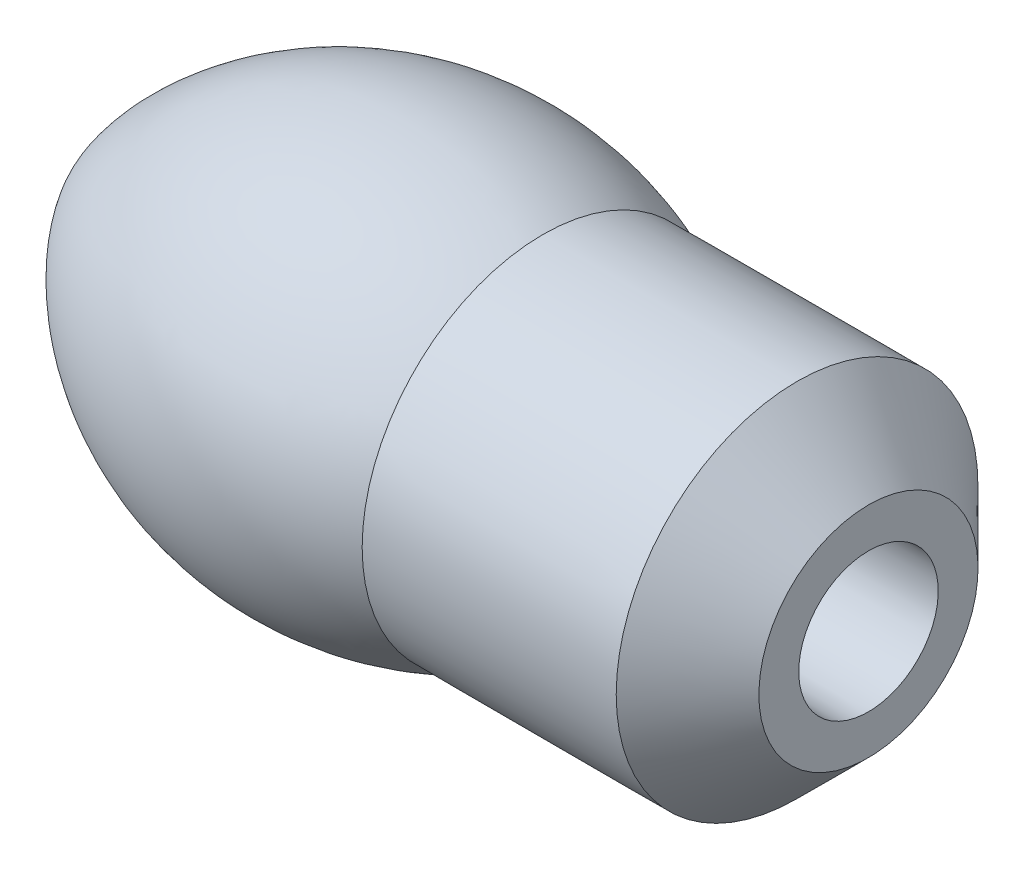
ISO-10303-21;
HEADER;
FILE_DESCRIPTION(('STEP AP214'),'2;1');
FILE_NAME('part.step','',(''),(''),'','','');
FILE_SCHEMA(('AUTOMOTIVE_DESIGN { 1 0 10303 214 1 1 1 1 }'));
ENDSEC;
DATA;
#1=APPLICATION_CONTEXT('core data for automotive mechanical design processes');
#2=APPLICATION_PROTOCOL_DEFINITION('international standard','automotive_design',2000,#1);
#3=PRODUCT_CONTEXT('',#1,'mechanical');
#4=PRODUCT('Part','Part','',(#3));
#5=PRODUCT_RELATED_PRODUCT_CATEGORY('part','',(#4));
#6=PRODUCT_DEFINITION_FORMATION('','',#4);
#7=PRODUCT_DEFINITION_CONTEXT('part definition',#1,'design');
#8=PRODUCT_DEFINITION('design','',#6,#7);
#9=PRODUCT_DEFINITION_SHAPE('','',#8);
#10=(LENGTH_UNIT() NAMED_UNIT(*) SI_UNIT(.MILLI.,.METRE.));
#11=(NAMED_UNIT(*) PLANE_ANGLE_UNIT() SI_UNIT($,.RADIAN.));
#12=(NAMED_UNIT(*) SI_UNIT($,.STERADIAN.) SOLID_ANGLE_UNIT());
#13=UNCERTAINTY_MEASURE_WITH_UNIT(LENGTH_MEASURE(1.E-05),#10,'distance_accuracy_value','');
#14=(GEOMETRIC_REPRESENTATION_CONTEXT(3) GLOBAL_UNCERTAINTY_ASSIGNED_CONTEXT((#13)) GLOBAL_UNIT_ASSIGNED_CONTEXT((#10,
#11,#12)) REPRESENTATION_CONTEXT('',''));
#15=CARTESIAN_POINT('',(0.,0.,0.));
#16=DIRECTION('',(0.,0.,1.));
#17=DIRECTION('',(1.,0.,0.));
#18=AXIS2_PLACEMENT_3D('',#15,#16,#17);
#19=CARTESIAN_POINT('',(0.,0.,0.));
#20=DIRECTION('',(-0.999999567116457,0.00093046595760574,0.));
#21=DIRECTION('',(-0.00093046595760574,-0.999999567116457,0.));
#22=AXIS2_PLACEMENT_3D('',#19,#20,#21);
#23=CONICAL_SURFACE('',#22,0.,1.56986586070303);
#24=CARTESIAN_POINT('',(-0.0243973146141929,2.27008805323411E-05,0.));
#25=DIRECTION('',(0.999999567116457,-0.00093046595760574,0.));
#26=DIRECTION('',(0.00093046595760574,0.999999567116457,0.));
#27=AXIS2_PLACEMENT_3D('',#24,#25,#26);
#28=CIRCLE('',#27,26.2205343621144);
#29=CARTESIAN_POINT('',(0.,26.2205457125571,0.));
#30=VERTEX_POINT('',#29);
#31=EDGE_CURVE('E11',#30,#30,#28,.T.);
#32=ORIENTED_EDGE('',*,*,#31,.T.);
#33=EDGE_LOOP('',(#32));
#34=FACE_BOUND('',#33,.T.);
#35=CARTESIAN_POINT('',(0.,0.,0.));
#36=VERTEX_POINT('',#35);
#37=VERTEX_LOOP('',#36);
#38=FACE_BOUND('',#37,.T.);
#39=ADVANCED_FACE('F39',(#34,#38),#23,.T.);
#40=CARTESIAN_POINT('',(-0.0243973146141929,2.27008805323411E-05,0.));
#41=DIRECTION('',(0.999999567116457,-0.00093046595760574,0.));
#42=DIRECTION('',(0.00093046595760574,0.999999567116457,0.));
#43=AXIS2_PLACEMENT_3D('',#40,#41,#42);
#44=CONICAL_SURFACE('',#43,26.2205343621144,0.000930466091866729);
#45=CARTESIAN_POINT('',(59.9755507393719,-0.055805232408808,0.));
#46=DIRECTION('',(0.999999567116457,-0.00093046595760574,0.));
#47=DIRECTION('',(0.00093046595760574,0.999999567116457,0.));
#48=AXIS2_PLACEMENT_3D('',#45,#46,#47);
#49=CIRCLE('',#48,26.2763623195707);
#50=CARTESIAN_POINT('',(60.,26.2205457125571,0.));
#51=VERTEX_POINT('',#50);
#52=EDGE_CURVE('E47',#51,#51,#49,.T.);
#53=ORIENTED_EDGE('',*,*,#52,.T.);
#54=EDGE_LOOP('',(#53));
#55=FACE_BOUND('',#54,.T.);
#56=ORIENTED_EDGE('',*,*,#31,.F.);
#57=EDGE_LOOP('',(#56));
#58=FACE_BOUND('',#57,.T.);
#59=ADVANCED_FACE('F76',(#55,#58),#44,.F.);
#60=CARTESIAN_POINT('',(59.9755507393719,-0.055805232408808,0.));
#61=DIRECTION('',(-0.999999567116457,0.00093046595760574,0.));
#62=DIRECTION('',(-0.00093046595760574,-0.999999567116457,0.));
#63=AXIS2_PLACEMENT_3D('',#60,#61,#62);
#64=CONICAL_SURFACE('',#63,26.2763623195707,1.56986586070303);
#65=CARTESIAN_POINT('',(59.9615937560496,-0.0557922459053341,0.));
#66=DIRECTION('',(0.999999567116457,-0.00093046595760574,0.));
#67=DIRECTION('',(0.00093046595760574,0.999999567116457,0.));
#68=AXIS2_PLACEMENT_3D('',#65,#66,#67);
#69=CIRCLE('',#68,41.2763558263176);
#70=CARTESIAN_POINT('',(60.,41.2205457125571,0.));
#71=VERTEX_POINT('',#70);
#72=EDGE_CURVE('E67',#71,#71,#69,.T.);
#73=ORIENTED_EDGE('',*,*,#72,.T.);
#74=EDGE_LOOP('',(#73));
#75=FACE_BOUND('',#74,.T.);
#76=ORIENTED_EDGE('',*,*,#52,.F.);
#77=EDGE_LOOP('',(#76));
#78=FACE_BOUND('',#77,.T.);
#79=ADVANCED_FACE('F79',(#75,#78),#64,.T.);
#80=CARTESIAN_POINT('',(59.9615937560496,-0.0557922459053341,0.));
#81=DIRECTION('',(-0.999999567116457,0.00093046595760574,0.));
#82=DIRECTION('',(-0.00093046595760574,-0.999999567116457,0.));
#83=AXIS2_PLACEMENT_3D('',#80,#81,#82);
#84=CONICAL_SURFACE('',#83,41.2763558263176,0.784467697305576);
#85=CARTESIAN_POINT('',(33.0665576710351,-0.0307673195667714,0.));
#86=DIRECTION('',(0.999999567116457,-0.00093046595760574,0.));
#87=DIRECTION('',(0.00093046595760574,0.999999567116457,0.));
#88=AXIS2_PLACEMENT_3D('',#85,#86,#87);
#89=CIRCLE('',#88,68.1214002058456);
#90=CARTESIAN_POINT('',(33.1299423149111,68.0906033976458,0.));
#91=VERTEX_POINT('',#90);
#92=EDGE_CURVE('E63',#91,#91,#89,.T.);
#93=ORIENTED_EDGE('',*,*,#92,.T.);
#94=EDGE_LOOP('',(#93));
#95=FACE_BOUND('',#94,.T.);
#96=ORIENTED_EDGE('',*,*,#72,.F.);
#97=EDGE_LOOP('',(#96));
#98=FACE_BOUND('',#97,.T.);
#99=ADVANCED_FACE('F81',(#95,#98),#84,.T.);
#100=CARTESIAN_POINT('',(33.0665576710351,-0.0307673195667714,0.));
#101=DIRECTION('',(0.999999567116457,-0.00093046595760574,0.));
#102=DIRECTION('',(0.00093046595760574,0.999999567116457,0.));
#103=AXIS2_PLACEMENT_3D('',#100,#101,#102);
#104=CONICAL_SURFACE('',#103,68.1214002058456,0.000930466091867145);
#105=CARTESIAN_POINT('',(-62.7097640732995,0.0583493259381555,0.));
#106=DIRECTION('',(0.999999567116457,-0.00093046595760574,0.));
#107=DIRECTION('',(0.00093046595760574,0.999999567116457,0.));
#108=AXIS2_PLACEMENT_3D('',#105,#106,#107);
#109=CIRCLE('',#108,68.0322835217635);
#110=CARTESIAN_POINT('',(-62.6464623494643,68.0906033976457,0.));
#111=VERTEX_POINT('',#110);
#112=EDGE_CURVE('E60',#111,#111,#109,.T.);
#113=ORIENTED_EDGE('',*,*,#112,.T.);
#114=EDGE_LOOP('',(#113));
#115=FACE_BOUND('',#114,.T.);
#116=ORIENTED_EDGE('',*,*,#92,.F.);
#117=EDGE_LOOP('',(#116));
#118=FACE_BOUND('',#117,.T.);
#119=ADVANCED_FACE('F56',(#115,#118),#104,.T.);
#120=CARTESIAN_POINT('',(-115.901735946042,-53.03472788402,0.));
#121=DIRECTION('',(0.,0.,-1.));
#122=DIRECTION('',(0.00093046595760574,0.999999567116457,0.));
#123=AXIS2_PLACEMENT_3D('',#120,#121,#122);
#124=CIRCLE('',#123,132.315796653082);
#125=TRIMMED_CURVE('',#124,(PARAMETER_VALUE(-1.15749574020338)),
(PARAMETER_VALUE(1.15749574020338)),.T.,.PARAMETER.);
#126=CARTESIAN_POINT('',(-115.85228861465,0.107796657330045,0.));
#127=DIRECTION('',(0.999999567116457,-0.00093046595760574,0.));
#128=AXIS1_PLACEMENT('',#126,#127);
#129=SURFACE_OF_REVOLUTION('',#125,#128);
#130=CARTESIAN_POINT('',(-237.027067227708,0.22054571255712,0.));
#131=VERTEX_POINT('',#130);
#132=VERTEX_LOOP('',#131);
#133=FACE_BOUND('',#132,.T.);
#134=ORIENTED_EDGE('',*,*,#112,.F.);
#135=EDGE_LOOP('',(#134));
#136=FACE_BOUND('',#135,.T.);
#137=ADVANCED_FACE('F53',(#133,#136),#129,.T.);
#138=CLOSED_SHELL('',(#39,#59,#79,#99,#119,#137));
#139=MANIFOLD_SOLID_BREP('B2',#138);
#140=ADVANCED_BREP_SHAPE_REPRESENTATION('',(#18,#139),#14);
#141=SHAPE_DEFINITION_REPRESENTATION(#9,#140);
ENDSEC;
END-ISO-10303-21;
